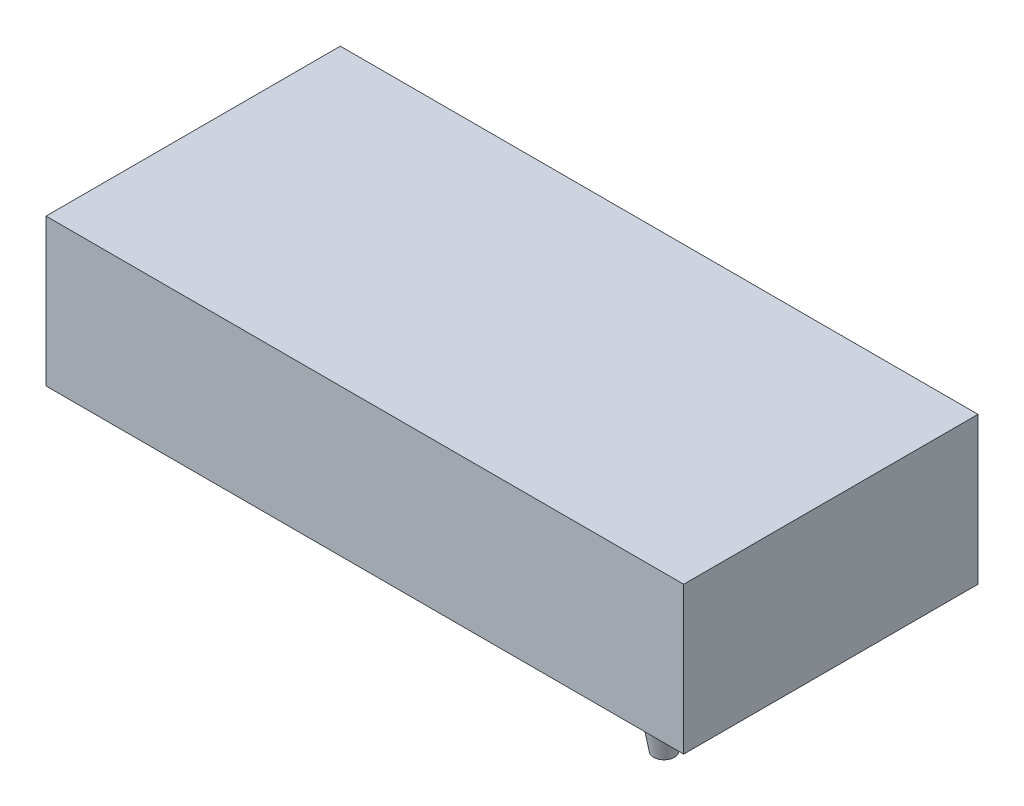
ISO-10303-21;
HEADER;
FILE_DESCRIPTION(('STEP AP214'),'2;1');
FILE_NAME('part.step','',(''),(''),'','','');
FILE_SCHEMA(('AUTOMOTIVE_DESIGN { 1 0 10303 214 1 1 1 1 }'));
ENDSEC;
DATA;
#1=APPLICATION_CONTEXT('core data for automotive mechanical design processes');
#2=APPLICATION_PROTOCOL_DEFINITION('international standard','automotive_design',2000,#1);
#3=PRODUCT_CONTEXT('',#1,'mechanical');
#4=PRODUCT('Part','Part','',(#3));
#5=PRODUCT_RELATED_PRODUCT_CATEGORY('part','',(#4));
#6=PRODUCT_DEFINITION_FORMATION('','',#4);
#7=PRODUCT_DEFINITION_CONTEXT('part definition',#1,'design');
#8=PRODUCT_DEFINITION('design','',#6,#7);
#9=PRODUCT_DEFINITION_SHAPE('','',#8);
#10=(LENGTH_UNIT() NAMED_UNIT(*) SI_UNIT(.MILLI.,.METRE.));
#11=(NAMED_UNIT(*) PLANE_ANGLE_UNIT() SI_UNIT($,.RADIAN.));
#12=(NAMED_UNIT(*) SI_UNIT($,.STERADIAN.) SOLID_ANGLE_UNIT());
#13=UNCERTAINTY_MEASURE_WITH_UNIT(LENGTH_MEASURE(1.E-05),#10,'distance_accuracy_value','');
#14=(GEOMETRIC_REPRESENTATION_CONTEXT(3) GLOBAL_UNCERTAINTY_ASSIGNED_CONTEXT((#13)) GLOBAL_UNIT_ASSIGNED_CONTEXT((#10,
#11,#12)) REPRESENTATION_CONTEXT('',''));
#15=CARTESIAN_POINT('',(0.,0.,0.));
#16=DIRECTION('',(0.,0.,1.));
#17=DIRECTION('',(1.,0.,0.));
#18=AXIS2_PLACEMENT_3D('',#15,#16,#17);
#19=CARTESIAN_POINT('',(0.,0.,0.));
#20=DIRECTION('',(0.,1.,0.));
#21=DIRECTION('',(0.,0.,1.));
#22=AXIS2_PLACEMENT_3D('',#19,#20,#21);
#23=PLANE('',#22);
#24=CARTESIAN_POINT('',(-26.5,0.,4.));
#25=DIRECTION('',(0.,1.,0.));
#26=DIRECTION('',(0.,0.,1.));
#27=AXIS2_PLACEMENT_3D('',#24,#25,#26);
#28=CIRCLE('',#27,1.9);
#29=CARTESIAN_POINT('',(-26.5,0.,5.9));
#30=VERTEX_POINT('',#29);
#31=EDGE_CURVE('E11',#30,#30,#28,.F.);
#32=ORIENTED_EDGE('',*,*,#31,.F.);
#33=EDGE_LOOP('',(#32));
#34=FACE_BOUND('',#33,.T.);
#35=CARTESIAN_POINT('',(26.5,0.,26.));
#36=DIRECTION('',(0.,1.,0.));
#37=DIRECTION('',(0.,0.,1.));
#38=AXIS2_PLACEMENT_3D('',#35,#36,#37);
#39=CIRCLE('',#38,1.9);
#40=CARTESIAN_POINT('',(26.5,0.,27.9));
#41=VERTEX_POINT('',#40);
#42=EDGE_CURVE('E40',#41,#41,#39,.F.);
#43=ORIENTED_EDGE('',*,*,#42,.F.);
#44=EDGE_LOOP('',(#43));
#45=FACE_BOUND('',#44,.T.);
#46=DIRECTION('',(0.,0.,-1.));
#47=VECTOR('',#46,1.);
#48=CARTESIAN_POINT('',(32.5,0.,30.));
#49=LINE('',#48,#47);
#50=CARTESIAN_POINT('',(32.5,0.,30.));
#51=VERTEX_POINT('',#50);
#52=CARTESIAN_POINT('',(32.5,0.,0.));
#53=VERTEX_POINT('',#52);
#54=EDGE_CURVE('E178',#51,#53,#49,.T.);
#55=ORIENTED_EDGE('',*,*,#54,.F.);
#56=DIRECTION('',(-1.,0.,0.));
#57=VECTOR('',#56,1.);
#58=CARTESIAN_POINT('',(0.,0.,30.));
#59=LINE('',#58,#57);
#60=CARTESIAN_POINT('',(-32.5,0.,30.));
#61=VERTEX_POINT('',#60);
#62=EDGE_CURVE('E118',#51,#61,#59,.T.);
#63=ORIENTED_EDGE('',*,*,#62,.T.);
#64=DIRECTION('',(0.,0.,1.));
#65=VECTOR('',#64,1.);
#66=CARTESIAN_POINT('',(-32.5,0.,30.));
#67=LINE('',#66,#65);
#68=CARTESIAN_POINT('',(-32.5,0.,25.5));
#69=VERTEX_POINT('',#68);
#70=EDGE_CURVE('E172',#69,#61,#67,.T.);
#71=ORIENTED_EDGE('',*,*,#70,.F.);
#72=DIRECTION('',(1.,0.,0.));
#73=VECTOR('',#72,1.);
#74=CARTESIAN_POINT('',(-35.4507407230331,0.,25.5));
#75=LINE('',#74,#73);
#76=CARTESIAN_POINT('',(-31.2507407230331,0.,25.5));
#77=VERTEX_POINT('',#76);
#78=EDGE_CURVE('E166',#69,#77,#75,.T.);
#79=ORIENTED_EDGE('',*,*,#78,.T.);
#80=DIRECTION('',(0.,0.,-1.));
#81=VECTOR('',#80,1.);
#82=CARTESIAN_POINT('',(-31.2507407230331,0.,15.));
#83=LINE('',#82,#81);
#84=CARTESIAN_POINT('',(-31.2507407230331,0.,22.56));
#85=VERTEX_POINT('',#84);
#86=EDGE_CURVE('E165',#77,#85,#83,.T.);
#87=ORIENTED_EDGE('',*,*,#86,.T.);
#88=DIRECTION('',(-1.,0.,0.));
#89=VECTOR('',#88,1.);
#90=CARTESIAN_POINT('',(25.4492592769669,0.,22.56));
#91=LINE('',#90,#89);
#92=CARTESIAN_POINT('',(25.4492592769669,0.,22.56));
#93=VERTEX_POINT('',#92);
#94=EDGE_CURVE('E153',#85,#93,#91,.F.);
#95=ORIENTED_EDGE('',*,*,#94,.T.);
#96=DIRECTION('',(0.,0.,1.));
#97=VECTOR('',#96,1.);
#98=CARTESIAN_POINT('',(25.4492592769669,0.,15.));
#99=LINE('',#98,#97);
#100=CARTESIAN_POINT('',(25.4492592769669,0.,18.15));
#101=VERTEX_POINT('',#100);
#102=EDGE_CURVE('E155',#101,#93,#99,.T.);
#103=ORIENTED_EDGE('',*,*,#102,.F.);
#104=DIRECTION('',(0.996194698091746,0.,-0.0871557427476584));
#105=VECTOR('',#104,1.);
#106=CARTESIAN_POINT('',(61.4539240306651,0.,15.));
#107=LINE('',#106,#105);
#108=CARTESIAN_POINT('',(28.539259276967,0.,17.8796600297049));
#109=VERTEX_POINT('',#108);
#110=EDGE_CURVE('E150',#101,#109,#107,.T.);
#111=ORIENTED_EDGE('',*,*,#110,.T.);
#112=DIRECTION('',(0.,0.,1.));
#113=VECTOR('',#112,1.);
#114=CARTESIAN_POINT('',(28.539259276967,0.,15.));
#115=LINE('',#114,#113);
#116=CARTESIAN_POINT('',(28.539259276967,0.,12.1203399702951));
#117=VERTEX_POINT('',#116);
#118=EDGE_CURVE('E53',#117,#109,#115,.T.);
#119=ORIENTED_EDGE('',*,*,#118,.F.);
#120=DIRECTION('',(-0.996194698091746,0.,-0.0871557427476584));
#121=VECTOR('',#120,1.);
#122=CARTESIAN_POINT('',(61.4539240306651,0.,15.));
#123=LINE('',#122,#121);
#124=CARTESIAN_POINT('',(25.4492592769669,0.,11.85));
#125=VERTEX_POINT('',#124);
#126=EDGE_CURVE('E47',#117,#125,#123,.T.);
#127=ORIENTED_EDGE('',*,*,#126,.T.);
#128=CARTESIAN_POINT('',(25.4492592769669,0.,7.44));
#129=VERTEX_POINT('',#128);
#130=EDGE_CURVE('E156',#129,#125,#99,.T.);
#131=ORIENTED_EDGE('',*,*,#130,.F.);
#132=DIRECTION('',(-1.,0.,0.));
#133=VECTOR('',#132,1.);
#134=CARTESIAN_POINT('',(25.4492592769669,0.,7.44));
#135=LINE('',#134,#133);
#136=CARTESIAN_POINT('',(-31.2507407230331,0.,7.44));
#137=VERTEX_POINT('',#136);
#138=EDGE_CURVE('E161',#129,#137,#135,.T.);
#139=ORIENTED_EDGE('',*,*,#138,.T.);
#140=CARTESIAN_POINT('',(-31.2507407230331,0.,4.5));
#141=VERTEX_POINT('',#140);
#142=EDGE_CURVE('E162',#137,#141,#83,.T.);
#143=ORIENTED_EDGE('',*,*,#142,.T.);
#144=DIRECTION('',(1.,0.,0.));
#145=VECTOR('',#144,1.);
#146=CARTESIAN_POINT('',(-35.4507407230331,0.,4.5));
#147=LINE('',#146,#145);
#148=CARTESIAN_POINT('',(-32.5,0.,4.5));
#149=VERTEX_POINT('',#148);
#150=EDGE_CURVE('E169',#141,#149,#147,.F.);
#151=ORIENTED_EDGE('',*,*,#150,.T.);
#152=CARTESIAN_POINT('',(-32.5,0.,0.));
#153=VERTEX_POINT('',#152);
#154=EDGE_CURVE('E170',#153,#149,#67,.T.);
#155=ORIENTED_EDGE('',*,*,#154,.F.);
#156=DIRECTION('',(-1.,0.,0.));
#157=VECTOR('',#156,1.);
#158=CARTESIAN_POINT('',(0.,0.,0.));
#159=LINE('',#158,#157);
#160=EDGE_CURVE('E158',#53,#153,#159,.T.);
#161=ORIENTED_EDGE('',*,*,#160,.F.);
#162=EDGE_LOOP('',(#55,#63,#71,#79,#87,#95,#103,#111,#119,#127,#131,#139,#143,#151,#155,#161));
#163=FACE_BOUND('',#162,.T.);
#164=ADVANCED_FACE('F33',(#34,#45,#163),#23,.F.);
#165=CARTESIAN_POINT('',(-32.5,-15.,30.));
#166=DIRECTION('',(1.,0.,0.));
#167=DIRECTION('',(0.,0.,-1.));
#168=AXIS2_PLACEMENT_3D('',#165,#166,#167);
#169=PLANE('',#168);
#170=DIRECTION('',(0.,-1.,0.));
#171=VECTOR('',#170,1.);
#172=CARTESIAN_POINT('',(-32.5,-15.,0.));
#173=LINE('',#172,#171);
#174=CARTESIAN_POINT('',(-32.5,15.,0.));
#175=VERTEX_POINT('',#174);
#176=EDGE_CURVE('E140',#175,#153,#173,.T.);
#177=ORIENTED_EDGE('',*,*,#176,.T.);
#178=ORIENTED_EDGE('',*,*,#154,.T.);
#179=CARTESIAN_POINT('',(-32.5,0.,15.));
#180=DIRECTION('',(1.,0.,0.));
#181=DIRECTION('',(0.,0.,-1.));
#182=AXIS2_PLACEMENT_3D('',#179,#180,#181);
#183=CIRCLE('',#182,10.5);
#184=EDGE_CURVE('E143',#69,#149,#183,.F.);
#185=ORIENTED_EDGE('',*,*,#184,.F.);
#186=ORIENTED_EDGE('',*,*,#70,.T.);
#187=DIRECTION('',(0.,-1.,0.));
#188=VECTOR('',#187,1.);
#189=CARTESIAN_POINT('',(-32.5,-15.,30.));
#190=LINE('',#189,#188);
#191=CARTESIAN_POINT('',(-32.5,15.,30.));
#192=VERTEX_POINT('',#191);
#193=EDGE_CURVE('E122',#192,#61,#190,.T.);
#194=ORIENTED_EDGE('',*,*,#193,.F.);
#195=DIRECTION('',(0.,0.,-1.));
#196=VECTOR('',#195,1.);
#197=CARTESIAN_POINT('',(-32.5,15.,30.));
#198=LINE('',#197,#196);
#199=EDGE_CURVE('E131',#192,#175,#198,.T.);
#200=ORIENTED_EDGE('',*,*,#199,.T.);
#201=EDGE_LOOP('',(#177,#178,#185,#186,#194,#200));
#202=FACE_BOUND('',#201,.T.);
#203=ADVANCED_FACE('F187',(#202),#169,.F.);
#204=CARTESIAN_POINT('',(32.5,-15.,30.));
#205=DIRECTION('',(-1.,0.,0.));
#206=DIRECTION('',(0.,0.,1.));
#207=AXIS2_PLACEMENT_3D('',#204,#205,#206);
#208=PLANE('',#207);
#209=DIRECTION('',(0.,1.,0.));
#210=VECTOR('',#209,1.);
#211=CARTESIAN_POINT('',(32.5,-15.,30.));
#212=LINE('',#211,#210);
#213=CARTESIAN_POINT('',(32.5,15.,30.));
#214=VERTEX_POINT('',#213);
#215=EDGE_CURVE('E110',#51,#214,#212,.T.);
#216=ORIENTED_EDGE('',*,*,#215,.F.);
#217=ORIENTED_EDGE('',*,*,#54,.T.);
#218=DIRECTION('',(0.,1.,0.));
#219=VECTOR('',#218,1.);
#220=CARTESIAN_POINT('',(32.5,-15.,0.));
#221=LINE('',#220,#219);
#222=CARTESIAN_POINT('',(32.5,15.,0.));
#223=VERTEX_POINT('',#222);
#224=EDGE_CURVE('E128',#53,#223,#221,.T.);
#225=ORIENTED_EDGE('',*,*,#224,.T.);
#226=DIRECTION('',(0.,0.,-1.));
#227=VECTOR('',#226,1.);
#228=CARTESIAN_POINT('',(32.5,15.,30.));
#229=LINE('',#228,#227);
#230=EDGE_CURVE('E125',#214,#223,#229,.T.);
#231=ORIENTED_EDGE('',*,*,#230,.F.);
#232=EDGE_LOOP('',(#216,#217,#225,#231));
#233=FACE_BOUND('',#232,.T.);
#234=ADVANCED_FACE('F126',(#233),#208,.F.);
#235=CARTESIAN_POINT('',(32.5,15.,30.));
#236=DIRECTION('',(0.,-1.,0.));
#237=DIRECTION('',(1.,0.,0.));
#238=AXIS2_PLACEMENT_3D('',#235,#236,#237);
#239=PLANE('',#238);
#240=DIRECTION('',(-1.,0.,0.));
#241=VECTOR('',#240,1.);
#242=CARTESIAN_POINT('',(32.5,15.,0.));
#243=LINE('',#242,#241);
#244=EDGE_CURVE('E145',#223,#175,#243,.T.);
#245=ORIENTED_EDGE('',*,*,#244,.T.);
#246=ORIENTED_EDGE('',*,*,#199,.F.);
#247=DIRECTION('',(-1.,0.,0.));
#248=VECTOR('',#247,1.);
#249=CARTESIAN_POINT('',(32.5,15.,30.));
#250=LINE('',#249,#248);
#251=EDGE_CURVE('E115',#214,#192,#250,.T.);
#252=ORIENTED_EDGE('',*,*,#251,.F.);
#253=ORIENTED_EDGE('',*,*,#230,.T.);
#254=EDGE_LOOP('',(#245,#246,#252,#253));
#255=FACE_BOUND('',#254,.T.);
#256=ADVANCED_FACE('F133',(#255),#239,.F.);
#257=CARTESIAN_POINT('',(0.,0.,30.));
#258=DIRECTION('',(0.,0.,1.));
#259=DIRECTION('',(1.,0.,0.));
#260=AXIS2_PLACEMENT_3D('',#257,#258,#259);
#261=PLANE('',#260);
#262=ORIENTED_EDGE('',*,*,#62,.F.);
#263=ORIENTED_EDGE('',*,*,#215,.T.);
#264=ORIENTED_EDGE('',*,*,#251,.T.);
#265=ORIENTED_EDGE('',*,*,#193,.T.);
#266=EDGE_LOOP('',(#262,#263,#264,#265));
#267=FACE_BOUND('',#266,.T.);
#268=ADVANCED_FACE('F112',(#267),#261,.T.);
#269=CARTESIAN_POINT('',(0.,0.,0.));
#270=DIRECTION('',(0.,0.,1.));
#271=DIRECTION('',(1.,0.,0.));
#272=AXIS2_PLACEMENT_3D('',#269,#270,#271);
#273=PLANE('',#272);
#274=ORIENTED_EDGE('',*,*,#224,.F.);
#275=ORIENTED_EDGE('',*,*,#160,.T.);
#276=ORIENTED_EDGE('',*,*,#176,.F.);
#277=ORIENTED_EDGE('',*,*,#244,.F.);
#278=EDGE_LOOP('',(#274,#275,#276,#277));
#279=FACE_BOUND('',#278,.T.);
#280=ADVANCED_FACE('F193',(#279),#273,.F.);
#281=CARTESIAN_POINT('',(-35.4507407230331,0.,15.));
#282=DIRECTION('',(1.,0.,0.));
#283=DIRECTION('',(0.,-1.,0.));
#284=AXIS2_PLACEMENT_3D('',#281,#282,#283);
#285=CYLINDRICAL_SURFACE('',#284,10.5);
#286=ORIENTED_EDGE('',*,*,#78,.F.);
#287=ORIENTED_EDGE('',*,*,#184,.T.);
#288=ORIENTED_EDGE('',*,*,#150,.F.);
#289=CARTESIAN_POINT('',(-31.2507407230331,0.,15.));
#290=DIRECTION('',(-1.,0.,0.));
#291=DIRECTION('',(0.,1.,0.));
#292=AXIS2_PLACEMENT_3D('',#289,#290,#291);
#293=CIRCLE('',#292,10.5);
#294=EDGE_CURVE('E206',#77,#141,#293,.T.);
#295=ORIENTED_EDGE('',*,*,#294,.F.);
#296=EDGE_LOOP('',(#286,#287,#288,#295));
#297=FACE_BOUND('',#296,.T.);
#298=ADVANCED_FACE('F247',(#297),#285,.F.);
#299=CARTESIAN_POINT('',(-31.2507407230331,0.,15.));
#300=DIRECTION('',(-1.,0.,0.));
#301=DIRECTION('',(0.,1.,0.));
#302=AXIS2_PLACEMENT_3D('',#299,#300,#301);
#303=PLANE('',#302);
#304=ORIENTED_EDGE('',*,*,#86,.F.);
#305=ORIENTED_EDGE('',*,*,#294,.T.);
#306=ORIENTED_EDGE('',*,*,#142,.F.);
#307=CARTESIAN_POINT('',(-31.2507407230331,0.,15.));
#308=DIRECTION('',(-1.,0.,0.));
#309=DIRECTION('',(0.,-1.,0.));
#310=AXIS2_PLACEMENT_3D('',#307,#308,#309);
#311=CIRCLE('',#310,7.56);
#312=EDGE_CURVE('E203',#85,#137,#311,.T.);
#313=ORIENTED_EDGE('',*,*,#312,.F.);
#314=EDGE_LOOP('',(#304,#305,#306,#313));
#315=FACE_BOUND('',#314,.T.);
#316=ADVANCED_FACE('F243',(#315),#303,.T.);
#317=CARTESIAN_POINT('',(25.4492592769669,0.,15.));
#318=DIRECTION('',(1.,0.,0.));
#319=DIRECTION('',(0.,0.,-1.));
#320=AXIS2_PLACEMENT_3D('',#317,#318,#319);
#321=PLANE('',#320);
#322=CARTESIAN_POINT('',(25.4492592769669,0.,15.));
#323=DIRECTION('',(1.,0.,0.));
#324=DIRECTION('',(0.,0.,-1.));
#325=AXIS2_PLACEMENT_3D('',#322,#323,#324);
#326=CIRCLE('',#325,7.56);
#327=EDGE_CURVE('E149',#129,#93,#326,.T.);
#328=ORIENTED_EDGE('',*,*,#327,.F.);
#329=ORIENTED_EDGE('',*,*,#130,.T.);
#330=CARTESIAN_POINT('',(25.4492592769669,0.,15.));
#331=DIRECTION('',(1.,0.,0.));
#332=DIRECTION('',(0.,0.,-1.));
#333=AXIS2_PLACEMENT_3D('',#330,#331,#332);
#334=CIRCLE('',#333,3.15);
#335=EDGE_CURVE('E200',#125,#101,#334,.T.);
#336=ORIENTED_EDGE('',*,*,#335,.T.);
#337=ORIENTED_EDGE('',*,*,#102,.T.);
#338=EDGE_LOOP('',(#328,#329,#336,#337));
#339=FACE_BOUND('',#338,.T.);
#340=ADVANCED_FACE('F246',(#339),#321,.F.);
#341=CARTESIAN_POINT('',(25.4492592769669,0.,15.));
#342=DIRECTION('',(-1.,0.,0.));
#343=DIRECTION('',(0.,0.,1.));
#344=AXIS2_PLACEMENT_3D('',#341,#342,#343);
#345=CYLINDRICAL_SURFACE('',#344,7.56);
#346=ORIENTED_EDGE('',*,*,#138,.F.);
#347=ORIENTED_EDGE('',*,*,#327,.T.);
#348=ORIENTED_EDGE('',*,*,#94,.F.);
#349=ORIENTED_EDGE('',*,*,#312,.T.);
#350=EDGE_LOOP('',(#346,#347,#348,#349));
#351=FACE_BOUND('',#350,.T.);
#352=ADVANCED_FACE('F240',(#351),#345,.F.);
#353=CARTESIAN_POINT('',(28.539259276967,2.13084710756668E-13,15.));
#354=DIRECTION('',(1.,0.,0.));
#355=DIRECTION('',(0.,-1.,0.));
#356=AXIS2_PLACEMENT_3D('',#353,#354,#355);
#357=PLANE('',#356);
#358=CARTESIAN_POINT('',(28.539259276967,2.13084710756668E-13,15.));
#359=DIRECTION('',(1.,0.,0.));
#360=DIRECTION('',(0.,-1.,0.));
#361=AXIS2_PLACEMENT_3D('',#358,#359,#360);
#362=CIRCLE('',#361,2.87966002970489);
#363=EDGE_CURVE('E209',#117,#109,#362,.T.);
#364=ORIENTED_EDGE('',*,*,#363,.F.);
#365=ORIENTED_EDGE('',*,*,#118,.T.);
#366=EDGE_LOOP('',(#364,#365));
#367=FACE_BOUND('',#366,.T.);
#368=ADVANCED_FACE('F237',(#367),#357,.F.);
#369=CARTESIAN_POINT('',(25.449259276967,2.02296033419642E-13,15.));
#370=DIRECTION('',(-1.,0.,0.));
#371=DIRECTION('',(0.,-1.,0.));
#372=AXIS2_PLACEMENT_3D('',#369,#370,#371);
#373=CONICAL_SURFACE('',#372,3.15,0.0872664625997167);
#374=ORIENTED_EDGE('',*,*,#126,.F.);
#375=ORIENTED_EDGE('',*,*,#363,.T.);
#376=ORIENTED_EDGE('',*,*,#110,.F.);
#377=ORIENTED_EDGE('',*,*,#335,.F.);
#378=EDGE_LOOP('',(#374,#375,#376,#377));
#379=FACE_BOUND('',#378,.T.);
#380=ADVANCED_FACE('F189',(#379),#373,.F.);
#381=CARTESIAN_POINT('',(26.5,0.,26.));
#382=DIRECTION('',(0.,1.,0.));
#383=DIRECTION('',(0.,0.,-1.));
#384=AXIS2_PLACEMENT_3D('',#381,#382,#383);
#385=CONICAL_SURFACE('',#384,1.9,0.174532925199433);
#386=CARTESIAN_POINT('',(26.5,-4.75,26.));
#387=DIRECTION('',(0.,-1.,0.));
#388=DIRECTION('',(0.,0.,-1.));
#389=AXIS2_PLACEMENT_3D('',#386,#387,#388);
#390=CIRCLE('',#389,1.06244684163479);
#391=CARTESIAN_POINT('',(26.5,-4.75,24.9375531583652));
#392=VERTEX_POINT('',#391);
#393=EDGE_CURVE('E211',#392,#392,#390,.T.);
#394=ORIENTED_EDGE('',*,*,#393,.F.);
#395=EDGE_LOOP('',(#394));
#396=FACE_BOUND('',#395,.T.);
#397=ORIENTED_EDGE('',*,*,#42,.T.);
#398=EDGE_LOOP('',(#397));
#399=FACE_BOUND('',#398,.T.);
#400=ADVANCED_FACE('F183',(#396,#399),#385,.T.);
#401=CARTESIAN_POINT('',(26.5,-4.75,26.));
#402=DIRECTION('',(0.,-1.,0.));
#403=DIRECTION('',(0.,0.,-1.));
#404=AXIS2_PLACEMENT_3D('',#401,#402,#403);
#405=PLANE('',#404);
#406=ORIENTED_EDGE('',*,*,#393,.T.);
#407=EDGE_LOOP('',(#406));
#408=FACE_BOUND('',#407,.T.);
#409=ADVANCED_FACE('F223',(#408),#405,.T.);
#410=CARTESIAN_POINT('',(-26.5,0.,4.));
#411=DIRECTION('',(0.,1.,0.));
#412=DIRECTION('',(0.,0.,-1.));
#413=AXIS2_PLACEMENT_3D('',#410,#411,#412);
#414=CONICAL_SURFACE('',#413,1.9,0.174532925199433);
#415=CARTESIAN_POINT('',(-26.5,-4.75,4.));
#416=DIRECTION('',(0.,-1.,0.));
#417=DIRECTION('',(0.,0.,-1.));
#418=AXIS2_PLACEMENT_3D('',#415,#416,#417);
#419=CIRCLE('',#418,1.06244684163479);
#420=CARTESIAN_POINT('',(-26.5,-4.75,2.93755315836521));
#421=VERTEX_POINT('',#420);
#422=EDGE_CURVE('E214',#421,#421,#419,.T.);
#423=ORIENTED_EDGE('',*,*,#422,.F.);
#424=EDGE_LOOP('',(#423));
#425=FACE_BOUND('',#424,.T.);
#426=ORIENTED_EDGE('',*,*,#31,.T.);
#427=EDGE_LOOP('',(#426));
#428=FACE_BOUND('',#427,.T.);
#429=ADVANCED_FACE('F220',(#425,#428),#414,.T.);
#430=CARTESIAN_POINT('',(-26.5,-4.75,4.));
#431=DIRECTION('',(0.,-1.,0.));
#432=DIRECTION('',(0.,0.,-1.));
#433=AXIS2_PLACEMENT_3D('',#430,#431,#432);
#434=PLANE('',#433);
#435=ORIENTED_EDGE('',*,*,#422,.T.);
#436=EDGE_LOOP('',(#435));
#437=FACE_BOUND('',#436,.T.);
#438=ADVANCED_FACE('F218',(#437),#434,.T.);
#439=CLOSED_SHELL('',(#164,#203,#234,#256,#268,#280,#298,#316,#340,#352,#368,#380,#400,#409,
#429,#438));
#440=MANIFOLD_SOLID_BREP('B2',#439);
#441=ADVANCED_BREP_SHAPE_REPRESENTATION('',(#18,#440),#14);
#442=SHAPE_DEFINITION_REPRESENTATION(#9,#441);
ENDSEC;
END-ISO-10303-21;
